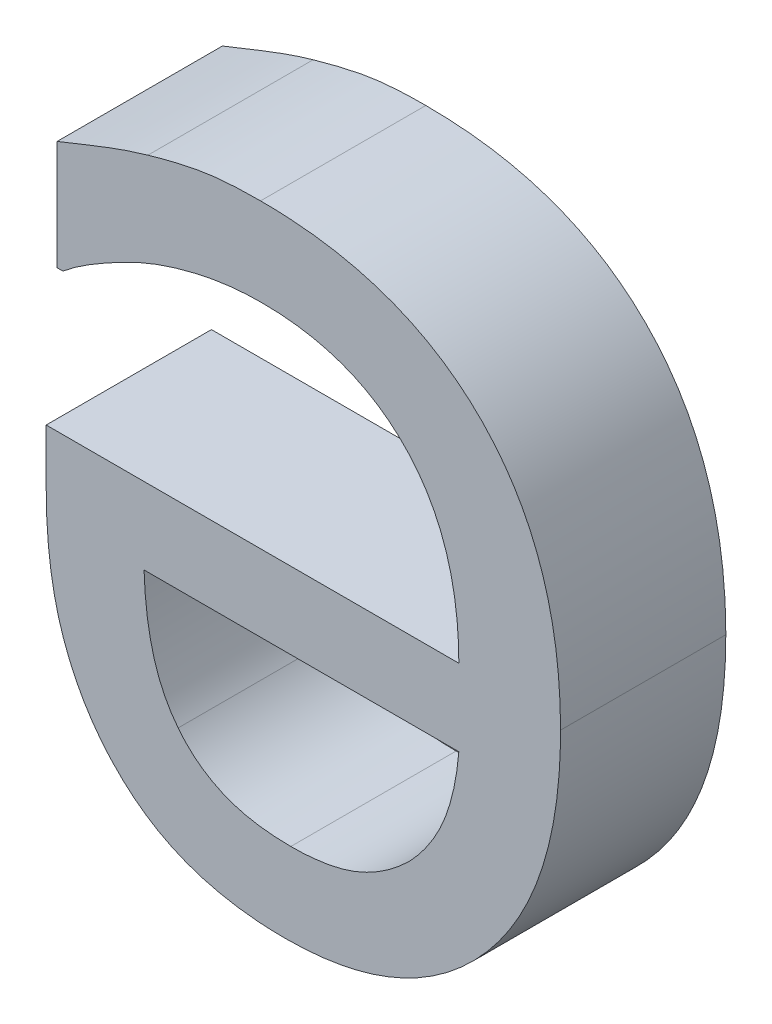
ISO-10303-21;
HEADER;
FILE_DESCRIPTION(('STEP AP214'),'2;1');
FILE_NAME('part.step','',(''),(''),'','','');
FILE_SCHEMA(('AUTOMOTIVE_DESIGN { 1 0 10303 214 1 1 1 1 }'));
ENDSEC;
DATA;
#1=APPLICATION_CONTEXT('core data for automotive mechanical design processes');
#2=APPLICATION_PROTOCOL_DEFINITION('international standard','automotive_design',2000,#1);
#3=PRODUCT_CONTEXT('',#1,'mechanical');
#4=PRODUCT('Part','Part','',(#3));
#5=PRODUCT_RELATED_PRODUCT_CATEGORY('part','',(#4));
#6=PRODUCT_DEFINITION_FORMATION('','',#4);
#7=PRODUCT_DEFINITION_CONTEXT('part definition',#1,'design');
#8=PRODUCT_DEFINITION('design','',#6,#7);
#9=PRODUCT_DEFINITION_SHAPE('','',#8);
#10=(LENGTH_UNIT() NAMED_UNIT(*) SI_UNIT(.MILLI.,.METRE.));
#11=(NAMED_UNIT(*) PLANE_ANGLE_UNIT() SI_UNIT($,.RADIAN.));
#12=(NAMED_UNIT(*) SI_UNIT($,.STERADIAN.) SOLID_ANGLE_UNIT());
#13=UNCERTAINTY_MEASURE_WITH_UNIT(LENGTH_MEASURE(1.E-05),#10,'distance_accuracy_value','');
#14=(GEOMETRIC_REPRESENTATION_CONTEXT(3) GLOBAL_UNCERTAINTY_ASSIGNED_CONTEXT((#13)) GLOBAL_UNIT_ASSIGNED_CONTEXT((#10,
#11,#12)) REPRESENTATION_CONTEXT('',''));
#15=CARTESIAN_POINT('',(0.,0.,0.));
#16=DIRECTION('',(0.,0.,1.));
#17=DIRECTION('',(1.,0.,0.));
#18=AXIS2_PLACEMENT_3D('',#15,#16,#17);
#19=CARTESIAN_POINT('',(-8.124000594715,-7.72739604329,0.));
#20=DIRECTION('',(0.,1.,0.));
#21=DIRECTION('',(-1.,0.,0.));
#22=AXIS2_PLACEMENT_3D('',#19,#20,#21);
#23=PLANE('',#22);
#24=DIRECTION('',(-1.,0.,0.));
#25=VECTOR('',#24,1.);
#26=CARTESIAN_POINT('',(-8.174873046972,-7.72739604329,0.));
#27=LINE('',#26,#25);
#28=CARTESIAN_POINT('',(-8.124000594715,-7.72739604329,0.));
#29=VERTEX_POINT('',#28);
#30=CARTESIAN_POINT('',(-8.314500279937,-7.72739604329,0.));
#31=VERTEX_POINT('',#30);
#32=EDGE_CURVE('E11',#29,#31,#27,.T.);
#33=ORIENTED_EDGE('',*,*,#32,.F.);
#34=DIRECTION('',(0.,0.,1.));
#35=VECTOR('',#34,1.);
#36=CARTESIAN_POINT('',(-8.124000594715,-7.72739604329,0.));
#37=LINE('',#36,#35);
#38=CARTESIAN_POINT('',(-8.124000594715,-7.72739604329,0.1));
#39=VERTEX_POINT('',#38);
#40=EDGE_CURVE('E24',#29,#39,#37,.T.);
#41=ORIENTED_EDGE('',*,*,#40,.T.);
#42=DIRECTION('',(1.,0.,0.));
#43=VECTOR('',#42,1.);
#44=CARTESIAN_POINT('',(-8.174873046972,-7.72739604329,0.1));
#45=LINE('',#44,#43);
#46=CARTESIAN_POINT('',(-8.314500279937,-7.72739604329,0.1));
#47=VERTEX_POINT('',#46);
#48=EDGE_CURVE('E414',#47,#39,#45,.T.);
#49=ORIENTED_EDGE('',*,*,#48,.F.);
#50=DIRECTION('',(0.,0.,1.));
#51=VECTOR('',#50,1.);
#52=CARTESIAN_POINT('',(-8.314500279937,-7.72739604329,0.));
#53=LINE('',#52,#51);
#54=EDGE_CURVE('E408',#31,#47,#53,.T.);
#55=ORIENTED_EDGE('',*,*,#54,.F.);
#56=EDGE_LOOP('',(#33,#41,#49,#55));
#57=FACE_BOUND('',#56,.T.);
#58=ADVANCED_FACE('F17',(#57),#23,.F.);
#59=CARTESIAN_POINT('',(-8.153607907756,-7.799466476349,0.));
#60=CARTESIAN_POINT('',(-8.153607907756,-7.799466476349,0.1));
#61=CARTESIAN_POINT('',(-8.139972960961,-7.785052389737,0.));
#62=CARTESIAN_POINT('',(-8.139972960961,-7.785052389737,0.1));
#63=CARTESIAN_POINT('',(-8.125948444258,-7.750380667887,0.));
#64=CARTESIAN_POINT('',(-8.125948444258,-7.750380667887,0.1));
#65=CARTESIAN_POINT('',(-8.124000594715,-7.72739604329,0.));
#66=CARTESIAN_POINT('',(-8.124000594715,-7.72739604329,0.1));
#67=B_SPLINE_SURFACE_WITH_KNOTS('',2,1,((#59,#60),(#61,#62),(#63,#64),(#65,#66)),.UNSPECIFIED.,
.F.,.F.,.F.,(3,1,3),(2,2),(0.,1.,2.),(0.,0.01),.UNSPECIFIED.);
#68=CARTESIAN_POINT('',(-8.153607907756,-7.799466476349,0.));
#69=CARTESIAN_POINT('',(-8.139972960961,-7.785052389737,0.));
#70=CARTESIAN_POINT('',(-8.125948444258,-7.750380667887,0.));
#71=CARTESIAN_POINT('',(-8.124000594715,-7.72739604329,0.));
#72=B_SPLINE_CURVE_WITH_KNOTS('',2,(#68,#69,#70,#71),.UNSPECIFIED.,.F.,.F.,(3,1,3),(0.,1.,2.),.UNSPECIFIED.);
#73=CARTESIAN_POINT('',(-8.153607907756,-7.799466476349,0.));
#74=VERTEX_POINT('',#73);
#75=EDGE_CURVE('E404',#74,#29,#72,.T.);
#76=DIRECTION('',(0.,0.,1.));
#77=VECTOR('',#76,1.);
#78=CARTESIAN_POINT('',(-8.153607907756,-7.799466476349,0.));
#79=LINE('',#78,#77);
#80=CARTESIAN_POINT('',(-8.153607907756,-7.799466476349,0.1));
#81=VERTEX_POINT('',#80);
#82=EDGE_CURVE('E398',#74,#81,#79,.T.);
#83=CARTESIAN_POINT('',(-8.124000594715,-7.72739604329,0.1));
#84=CARTESIAN_POINT('',(-8.125948444258,-7.750380667887,0.1));
#85=CARTESIAN_POINT('',(-8.139972960961,-7.785052389737,0.1));
#86=CARTESIAN_POINT('',(-8.153607907756,-7.799466476349,0.1));
#87=B_SPLINE_CURVE_WITH_KNOTS('',2,(#83,#84,#85,#86),.UNSPECIFIED.,.F.,.F.,(3,1,3),(-2.,-1.,0.),.UNSPECIFIED.);
#88=EDGE_CURVE('E391',#39,#81,#87,.T.);
#89=ORIENTED_EDGE('',*,*,#75,.F.);
#90=ORIENTED_EDGE('',*,*,#82,.T.);
#91=ORIENTED_EDGE('',*,*,#88,.F.);
#92=ORIENTED_EDGE('',*,*,#40,.F.);
#93=EDGE_LOOP('',(#89,#90,#91,#92));
#94=FACE_BOUND('',#93,.T.);
#95=ADVANCED_FACE('F420',(#94),#67,.F.);
#96=CARTESIAN_POINT('',(-8.225678340815,-7.827905079665,0.));
#97=CARTESIAN_POINT('',(-8.225678340815,-7.827905079665,0.1));
#98=CARTESIAN_POINT('',(-8.201525006493,-7.827905079665,0.));
#99=CARTESIAN_POINT('',(-8.201525006493,-7.827905079665,0.1));
#100=CARTESIAN_POINT('',(-8.167632424459,-7.813490993053,0.));
#101=CARTESIAN_POINT('',(-8.167632424459,-7.813490993053,0.1));
#102=CARTESIAN_POINT('',(-8.153607907756,-7.799466476349,0.));
#103=CARTESIAN_POINT('',(-8.153607907756,-7.799466476349,0.1));
#104=B_SPLINE_SURFACE_WITH_KNOTS('',2,1,((#96,#97),(#98,#99),(#100,#101),(#102,#103)),
.UNSPECIFIED.,.F.,.F.,.F.,(3,1,3),(2,2),(0.,1.,2.),(0.,0.01),.UNSPECIFIED.);
#105=CARTESIAN_POINT('',(-8.225678340815,-7.827905079665,0.));
#106=CARTESIAN_POINT('',(-8.201525006493,-7.827905079665,0.));
#107=CARTESIAN_POINT('',(-8.167632424459,-7.813490993053,0.));
#108=CARTESIAN_POINT('',(-8.153607907756,-7.799466476349,0.));
#109=B_SPLINE_CURVE_WITH_KNOTS('',2,(#105,#106,#107,#108),.UNSPECIFIED.,.F.,.F.,(3,1,3),(0.,1.,
2.),.UNSPECIFIED.);
#110=CARTESIAN_POINT('',(-8.225678340815,-7.827905079665,0.));
#111=VERTEX_POINT('',#110);
#112=EDGE_CURVE('E386',#111,#74,#109,.T.);
#113=DIRECTION('',(0.,0.,1.));
#114=VECTOR('',#113,1.);
#115=CARTESIAN_POINT('',(-8.225678340815,-7.827905079665,0.));
#116=LINE('',#115,#114);
#117=CARTESIAN_POINT('',(-8.225678340815,-7.827905079665,0.1));
#118=VERTEX_POINT('',#117);
#119=EDGE_CURVE('E380',#111,#118,#116,.T.);
#120=CARTESIAN_POINT('',(-8.153607907756,-7.799466476349,0.1));
#121=CARTESIAN_POINT('',(-8.167632424459,-7.813490993053,0.1));
#122=CARTESIAN_POINT('',(-8.201525006493,-7.827905079665,0.1));
#123=CARTESIAN_POINT('',(-8.225678340815,-7.827905079665,0.1));
#124=B_SPLINE_CURVE_WITH_KNOTS('',2,(#120,#121,#122,#123),.UNSPECIFIED.,.F.,.F.,(3,1,3),(-2.,
-1.,0.),.UNSPECIFIED.);
#125=EDGE_CURVE('E373',#81,#118,#124,.T.);
#126=ORIENTED_EDGE('',*,*,#112,.F.);
#127=ORIENTED_EDGE('',*,*,#119,.T.);
#128=ORIENTED_EDGE('',*,*,#125,.F.);
#129=ORIENTED_EDGE('',*,*,#82,.F.);
#130=EDGE_LOOP('',(#126,#127,#128,#129));
#131=FACE_BOUND('',#130,.T.);
#132=ADVANCED_FACE('F424',(#131),#104,.F.);
#133=CARTESIAN_POINT('',(-8.29385307479,-7.799856046258,0.));
#134=CARTESIAN_POINT('',(-8.29385307479,-7.799856046258,0.1));
#135=CARTESIAN_POINT('',(-8.283334687263,-7.813490993053,0.));
#136=CARTESIAN_POINT('',(-8.283334687263,-7.813490993053,0.1));
#137=CARTESIAN_POINT('',(-8.250221245046,-7.827905079665,0.));
#138=CARTESIAN_POINT('',(-8.250221245046,-7.827905079665,0.1));
#139=CARTESIAN_POINT('',(-8.225678340815,-7.827905079665,0.));
#140=CARTESIAN_POINT('',(-8.225678340815,-7.827905079665,0.1));
#141=B_SPLINE_SURFACE_WITH_KNOTS('',2,1,((#133,#134),(#135,#136),(#137,#138),(#139,#140)),
.UNSPECIFIED.,.F.,.F.,.F.,(3,1,3),(2,2),(0.,1.,2.),(0.,0.01),.UNSPECIFIED.);
#142=CARTESIAN_POINT('',(-8.29385307479,-7.799856046258,0.));
#143=CARTESIAN_POINT('',(-8.283334687263,-7.813490993053,0.));
#144=CARTESIAN_POINT('',(-8.250221245046,-7.827905079665,0.));
#145=CARTESIAN_POINT('',(-8.225678340815,-7.827905079665,0.));
#146=B_SPLINE_CURVE_WITH_KNOTS('',2,(#142,#143,#144,#145),.UNSPECIFIED.,.F.,.F.,(3,1,3),(0.,1.,
2.),.UNSPECIFIED.);
#147=CARTESIAN_POINT('',(-8.29385307479,-7.799856046258,0.));
#148=VERTEX_POINT('',#147);
#149=EDGE_CURVE('E368',#148,#111,#146,.T.);
#150=DIRECTION('',(0.,0.,1.));
#151=VECTOR('',#150,1.);
#152=CARTESIAN_POINT('',(-8.29385307479,-7.799856046258,0.));
#153=LINE('',#152,#151);
#154=CARTESIAN_POINT('',(-8.29385307479,-7.799856046258,0.1));
#155=VERTEX_POINT('',#154);
#156=EDGE_CURVE('E362',#148,#155,#153,.T.);
#157=CARTESIAN_POINT('',(-8.225678340815,-7.827905079665,0.1));
#158=CARTESIAN_POINT('',(-8.250221245046,-7.827905079665,0.1));
#159=CARTESIAN_POINT('',(-8.283334687263,-7.813490993053,0.1));
#160=CARTESIAN_POINT('',(-8.29385307479,-7.799856046258,0.1));
#161=B_SPLINE_CURVE_WITH_KNOTS('',2,(#157,#158,#159,#160),.UNSPECIFIED.,.F.,.F.,(3,1,3),(-2.,
-1.,0.),.UNSPECIFIED.);
#162=EDGE_CURVE('E355',#118,#155,#161,.T.);
#163=ORIENTED_EDGE('',*,*,#149,.F.);
#164=ORIENTED_EDGE('',*,*,#156,.T.);
#165=ORIENTED_EDGE('',*,*,#162,.F.);
#166=ORIENTED_EDGE('',*,*,#119,.F.);
#167=EDGE_LOOP('',(#163,#164,#165,#166));
#168=FACE_BOUND('',#167,.T.);
#169=ADVANCED_FACE('F428',(#168),#141,.F.);
#170=CARTESIAN_POINT('',(-8.314500279937,-7.72739604329,0.));
#171=CARTESIAN_POINT('',(-8.314500279937,-7.72739604329,0.1));
#172=CARTESIAN_POINT('',(-8.31372114012,-7.751938947521,0.));
#173=CARTESIAN_POINT('',(-8.31372114012,-7.751938947521,0.1));
#174=CARTESIAN_POINT('',(-8.303592322501,-7.787779379096,0.));
#175=CARTESIAN_POINT('',(-8.303592322501,-7.787779379096,0.1));
#176=CARTESIAN_POINT('',(-8.29385307479,-7.799856046258,0.));
#177=CARTESIAN_POINT('',(-8.29385307479,-7.799856046258,0.1));
#178=B_SPLINE_SURFACE_WITH_KNOTS('',2,1,((#170,#171),(#172,#173),(#174,#175),(#176,#177)),
.UNSPECIFIED.,.F.,.F.,.F.,(3,1,3),(2,2),(0.,1.,2.),(0.,0.01),.UNSPECIFIED.);
#179=CARTESIAN_POINT('',(-8.314500279937,-7.72739604329,0.));
#180=CARTESIAN_POINT('',(-8.31372114012,-7.751938947521,0.));
#181=CARTESIAN_POINT('',(-8.303592322501,-7.787779379096,0.));
#182=CARTESIAN_POINT('',(-8.29385307479,-7.799856046258,0.));
#183=B_SPLINE_CURVE_WITH_KNOTS('',2,(#179,#180,#181,#182),.UNSPECIFIED.,.F.,.F.,(3,1,3),(0.,1.,
2.),.UNSPECIFIED.);
#184=EDGE_CURVE('E348',#31,#148,#183,.T.);
#185=CARTESIAN_POINT('',(-8.29385307479,-7.799856046258,0.1));
#186=CARTESIAN_POINT('',(-8.303592322501,-7.787779379096,0.1));
#187=CARTESIAN_POINT('',(-8.31372114012,-7.751938947521,0.1));
#188=CARTESIAN_POINT('',(-8.314500279937,-7.72739604329,0.1));
#189=B_SPLINE_CURVE_WITH_KNOTS('',2,(#185,#186,#187,#188),.UNSPECIFIED.,.F.,.F.,(3,1,3),(-2.,
-1.,0.),.UNSPECIFIED.);
#190=EDGE_CURVE('E340',#155,#47,#189,.T.);
#191=ORIENTED_EDGE('',*,*,#184,.F.);
#192=ORIENTED_EDGE('',*,*,#54,.T.);
#193=ORIENTED_EDGE('',*,*,#190,.F.);
#194=ORIENTED_EDGE('',*,*,#156,.F.);
#195=EDGE_LOOP('',(#191,#192,#193,#194));
#196=FACE_BOUND('',#195,.T.);
#197=ADVANCED_FACE('F431',(#196),#178,.F.);
#198=CARTESIAN_POINT('',(-8.229184469991,-7.877770027944,0.));
#199=CARTESIAN_POINT('',(-8.229184469991,-7.877770027944,0.1));
#200=CARTESIAN_POINT('',(-8.154776617481,-7.877770027944,0.));
#201=CARTESIAN_POINT('',(-8.154776617481,-7.877770027944,0.1));
#202=CARTESIAN_POINT('',(-8.062448549184,-7.773365292485,0.));
#203=CARTESIAN_POINT('',(-8.062448549184,-7.773365292485,0.1));
#204=CARTESIAN_POINT('',(-8.062448549184,-7.68532249318,0.));
#205=CARTESIAN_POINT('',(-8.062448549184,-7.68532249318,0.1));
#206=B_SPLINE_SURFACE_WITH_KNOTS('',2,1,((#198,#199),(#200,#201),(#202,#203),(#204,#205)),
.UNSPECIFIED.,.F.,.F.,.F.,(3,1,3),(2,2),(-2.,-1.,0.),(0.,0.01),.UNSPECIFIED.);
#207=CARTESIAN_POINT('',(-8.062448549184,-7.68532249318,0.));
#208=CARTESIAN_POINT('',(-8.062448549184,-7.773365292485,0.));
#209=CARTESIAN_POINT('',(-8.154776617481,-7.877770027944,0.));
#210=CARTESIAN_POINT('',(-8.229184469991,-7.877770027944,0.));
#211=B_SPLINE_CURVE_WITH_KNOTS('',2,(#207,#208,#209,#210),.UNSPECIFIED.,.F.,.F.,(3,1,3),(0.,1.,
2.),.UNSPECIFIED.);
#212=CARTESIAN_POINT('',(-8.062448549184,-7.68532249318,0.));
#213=VERTEX_POINT('',#212);
#214=CARTESIAN_POINT('',(-8.229184469991,-7.877770027944,0.));
#215=VERTEX_POINT('',#214);
#216=EDGE_CURVE('E336',#213,#215,#211,.T.);
#217=DIRECTION('',(0.,0.,1.));
#218=VECTOR('',#217,1.);
#219=CARTESIAN_POINT('',(-8.062448549184,-7.68532249318,0.));
#220=LINE('',#219,#218);
#221=CARTESIAN_POINT('',(-8.062448549184,-7.68532249318,0.1));
#222=VERTEX_POINT('',#221);
#223=EDGE_CURVE('E331',#213,#222,#220,.T.);
#224=CARTESIAN_POINT('',(-8.229184469991,-7.877770027944,0.1));
#225=CARTESIAN_POINT('',(-8.154776617481,-7.877770027944,0.1));
#226=CARTESIAN_POINT('',(-8.062448549184,-7.773365292485,0.1));
#227=CARTESIAN_POINT('',(-8.062448549184,-7.68532249318,0.1));
#228=B_SPLINE_CURVE_WITH_KNOTS('',2,(#224,#225,#226,#227),.UNSPECIFIED.,.F.,.F.,(3,1,3),(-2.,
-1.,0.),.UNSPECIFIED.);
#229=CARTESIAN_POINT('',(-8.229184469991,-7.877770027944,0.1));
#230=VERTEX_POINT('',#229);
#231=EDGE_CURVE('E164',#230,#222,#228,.T.);
#232=DIRECTION('',(0.,0.,1.));
#233=VECTOR('',#232,1.);
#234=CARTESIAN_POINT('',(-8.229184469991,-7.877770027944,0.));
#235=LINE('',#234,#233);
#236=EDGE_CURVE('E322',#215,#230,#235,.T.);
#237=ORIENTED_EDGE('',*,*,#216,.F.);
#238=ORIENTED_EDGE('',*,*,#223,.T.);
#239=ORIENTED_EDGE('',*,*,#231,.F.);
#240=ORIENTED_EDGE('',*,*,#236,.F.);
#241=EDGE_LOOP('',(#237,#238,#239,#240));
#242=FACE_BOUND('',#241,.T.);
#243=ADVANCED_FACE('F479',(#242),#206,.T.);
#244=CARTESIAN_POINT('',(-8.33358920545,-7.837644327375,0.));
#245=CARTESIAN_POINT('',(-8.33358920545,-7.837644327375,0.1));
#246=CARTESIAN_POINT('',(-8.314500279937,-7.858291532522,0.));
#247=CARTESIAN_POINT('',(-8.314500279937,-7.858291532522,0.1));
#248=CARTESIAN_POINT('',(-8.262687482116,-7.877770027944,0.));
#249=CARTESIAN_POINT('',(-8.262687482116,-7.877770027944,0.1));
#250=CARTESIAN_POINT('',(-8.229184469991,-7.877770027944,0.));
#251=CARTESIAN_POINT('',(-8.229184469991,-7.877770027944,0.1));
#252=B_SPLINE_SURFACE_WITH_KNOTS('',2,1,((#244,#245),(#246,#247),(#248,#249),(#250,#251)),
.UNSPECIFIED.,.F.,.F.,.F.,(3,1,3),(2,2),(-2.,-1.,0.),(0.,0.01),.UNSPECIFIED.);
#253=CARTESIAN_POINT('',(-8.229184469991,-7.877770027944,0.));
#254=CARTESIAN_POINT('',(-8.262687482116,-7.877770027944,0.));
#255=CARTESIAN_POINT('',(-8.314500279937,-7.858291532522,0.));
#256=CARTESIAN_POINT('',(-8.33358920545,-7.837644327375,0.));
#257=B_SPLINE_CURVE_WITH_KNOTS('',2,(#253,#254,#255,#256),.UNSPECIFIED.,.F.,.F.,(3,1,3),(0.,1.,
2.),.UNSPECIFIED.);
#258=CARTESIAN_POINT('',(-8.33358920545,-7.837644327375,0.));
#259=VERTEX_POINT('',#258);
#260=EDGE_CURVE('E315',#215,#259,#257,.T.);
#261=CARTESIAN_POINT('',(-8.33358920545,-7.837644327375,0.1));
#262=CARTESIAN_POINT('',(-8.314500279937,-7.858291532522,0.1));
#263=CARTESIAN_POINT('',(-8.262687482116,-7.877770027944,0.1));
#264=CARTESIAN_POINT('',(-8.229184469991,-7.877770027944,0.1));
#265=B_SPLINE_CURVE_WITH_KNOTS('',2,(#261,#262,#263,#264),.UNSPECIFIED.,.F.,.F.,(3,1,3),(-2.,
-1.,0.),.UNSPECIFIED.);
#266=CARTESIAN_POINT('',(-8.33358920545,-7.837644327375,0.1));
#267=VERTEX_POINT('',#266);
#268=EDGE_CURVE('E311',#267,#230,#265,.T.);
#269=DIRECTION('',(0.,0.,1.));
#270=VECTOR('',#269,1.);
#271=CARTESIAN_POINT('',(-8.33358920545,-7.837644327375,0.));
#272=LINE('',#271,#270);
#273=EDGE_CURVE('E305',#259,#267,#272,.T.);
#274=ORIENTED_EDGE('',*,*,#260,.F.);
#275=ORIENTED_EDGE('',*,*,#236,.T.);
#276=ORIENTED_EDGE('',*,*,#268,.F.);
#277=ORIENTED_EDGE('',*,*,#273,.F.);
#278=EDGE_LOOP('',(#274,#275,#276,#277));
#279=FACE_BOUND('',#278,.T.);
#280=ADVANCED_FACE('F489',(#279),#252,.T.);
#281=CARTESIAN_POINT('',(-8.373714906018,-7.714150666403,0.));
#282=CARTESIAN_POINT('',(-8.373714906018,-7.714150666403,0.1));
#283=CARTESIAN_POINT('',(-8.373714906018,-7.757392926239,0.));
#284=CARTESIAN_POINT('',(-8.373714906018,-7.757392926239,0.1));
#285=CARTESIAN_POINT('',(-8.353067700872,-7.816997122229,0.));
#286=CARTESIAN_POINT('',(-8.353067700872,-7.816997122229,0.1));
#287=CARTESIAN_POINT('',(-8.33358920545,-7.837644327375,0.));
#288=CARTESIAN_POINT('',(-8.33358920545,-7.837644327375,0.1));
#289=B_SPLINE_SURFACE_WITH_KNOTS('',2,1,((#281,#282),(#283,#284),(#285,#286),(#287,#288)),
.UNSPECIFIED.,.F.,.F.,.F.,(3,1,3),(2,2),(-2.,-1.,0.),(0.,0.01),.UNSPECIFIED.);
#290=CARTESIAN_POINT('',(-8.33358920545,-7.837644327375,0.));
#291=CARTESIAN_POINT('',(-8.353067700872,-7.816997122229,0.));
#292=CARTESIAN_POINT('',(-8.373714906018,-7.757392926239,0.));
#293=CARTESIAN_POINT('',(-8.373714906018,-7.714150666403,0.));
#294=B_SPLINE_CURVE_WITH_KNOTS('',2,(#290,#291,#292,#293),.UNSPECIFIED.,.F.,.F.,(3,1,3),(0.,1.,
2.),.UNSPECIFIED.);
#295=CARTESIAN_POINT('',(-8.373714906018,-7.714150666403,0.));
#296=VERTEX_POINT('',#295);
#297=EDGE_CURVE('E298',#259,#296,#294,.T.);
#298=CARTESIAN_POINT('',(-8.373714906018,-7.714150666403,0.1));
#299=CARTESIAN_POINT('',(-8.373714906018,-7.757392926239,0.1));
#300=CARTESIAN_POINT('',(-8.353067700872,-7.816997122229,0.1));
#301=CARTESIAN_POINT('',(-8.33358920545,-7.837644327375,0.1));
#302=B_SPLINE_CURVE_WITH_KNOTS('',2,(#298,#299,#300,#301),.UNSPECIFIED.,.F.,.F.,(3,1,3),(-2.,
-1.,0.),.UNSPECIFIED.);
#303=CARTESIAN_POINT('',(-8.373714906018,-7.714150666403,0.1));
#304=VERTEX_POINT('',#303);
#305=EDGE_CURVE('E293',#304,#267,#302,.T.);
#306=DIRECTION('',(0.,0.,1.));
#307=VECTOR('',#306,1.);
#308=CARTESIAN_POINT('',(-8.373714906018,-7.714150666403,0.));
#309=LINE('',#308,#307);
#310=EDGE_CURVE('E290',#296,#304,#309,.T.);
#311=ORIENTED_EDGE('',*,*,#297,.F.);
#312=ORIENTED_EDGE('',*,*,#273,.T.);
#313=ORIENTED_EDGE('',*,*,#305,.F.);
#314=ORIENTED_EDGE('',*,*,#310,.F.);
#315=EDGE_LOOP('',(#311,#312,#313,#314));
#316=FACE_BOUND('',#315,.T.);
#317=ADVANCED_FACE('F500',(#316),#289,.T.);
#318=CARTESIAN_POINT('',(-8.373714906018,-7.681037224187,0.));
#319=DIRECTION('',(-1.,0.,0.));
#320=DIRECTION('',(0.,-1.,0.));
#321=AXIS2_PLACEMENT_3D('',#318,#319,#320);
#322=PLANE('',#321);
#323=DIRECTION('',(0.,1.,0.));
#324=VECTOR('',#323,1.);
#325=CARTESIAN_POINT('',(-8.373714906018,-7.714150666403,0.));
#326=LINE('',#325,#324);
#327=CARTESIAN_POINT('',(-8.373714906018,-7.681037224187,0.));
#328=VERTEX_POINT('',#327);
#329=EDGE_CURVE('E288',#296,#328,#326,.T.);
#330=ORIENTED_EDGE('',*,*,#329,.F.);
#331=ORIENTED_EDGE('',*,*,#310,.T.);
#332=DIRECTION('',(0.,-1.,0.));
#333=VECTOR('',#332,1.);
#334=CARTESIAN_POINT('',(-8.373714906018,-7.714150666403,0.1));
#335=LINE('',#334,#333);
#336=CARTESIAN_POINT('',(-8.373714906018,-7.681037224187,0.1));
#337=VERTEX_POINT('',#336);
#338=EDGE_CURVE('E285',#337,#304,#335,.T.);
#339=ORIENTED_EDGE('',*,*,#338,.F.);
#340=DIRECTION('',(0.,0.,1.));
#341=VECTOR('',#340,1.);
#342=CARTESIAN_POINT('',(-8.373714906018,-7.681037224187,0.));
#343=LINE('',#342,#341);
#344=EDGE_CURVE('E282',#328,#337,#343,.T.);
#345=ORIENTED_EDGE('',*,*,#344,.F.);
#346=EDGE_LOOP('',(#330,#331,#339,#345));
#347=FACE_BOUND('',#346,.T.);
#348=ADVANCED_FACE('F511',(#347),#322,.T.);
#349=CARTESIAN_POINT('',(-8.124000594715,-7.681037224187,0.));
#350=DIRECTION('',(0.,1.,0.));
#351=DIRECTION('',(-1.,0.,0.));
#352=AXIS2_PLACEMENT_3D('',#349,#350,#351);
#353=PLANE('',#352);
#354=DIRECTION('',(1.,0.,0.));
#355=VECTOR('',#354,1.);
#356=CARTESIAN_POINT('',(-8.373714906018,-7.681037224187,0.));
#357=LINE('',#356,#355);
#358=CARTESIAN_POINT('',(-8.124000594715,-7.681037224187,0.));
#359=VERTEX_POINT('',#358);
#360=EDGE_CURVE('E280',#328,#359,#357,.T.);
#361=ORIENTED_EDGE('',*,*,#360,.F.);
#362=ORIENTED_EDGE('',*,*,#344,.T.);
#363=DIRECTION('',(-1.,0.,0.));
#364=VECTOR('',#363,1.);
#365=CARTESIAN_POINT('',(-8.373714906018,-7.681037224187,0.1));
#366=LINE('',#365,#364);
#367=CARTESIAN_POINT('',(-8.124000594715,-7.681037224187,0.1));
#368=VERTEX_POINT('',#367);
#369=EDGE_CURVE('E277',#368,#337,#366,.T.);
#370=ORIENTED_EDGE('',*,*,#369,.F.);
#371=DIRECTION('',(0.,0.,1.));
#372=VECTOR('',#371,1.);
#373=CARTESIAN_POINT('',(-8.124000594715,-7.681037224187,0.));
#374=LINE('',#373,#372);
#375=EDGE_CURVE('E271',#359,#368,#374,.T.);
#376=ORIENTED_EDGE('',*,*,#375,.F.);
#377=EDGE_LOOP('',(#361,#362,#370,#376));
#378=FACE_BOUND('',#377,.T.);
#379=ADVANCED_FACE('F520',(#378),#353,.T.);
#380=CARTESIAN_POINT('',(-8.243208986695,-7.551700014589,0.));
#381=CARTESIAN_POINT('',(-8.243208986695,-7.551700014589,0.1));
#382=CARTESIAN_POINT('',(-8.187110919881,-7.551700014589,0.));
#383=CARTESIAN_POINT('',(-8.187110919881,-7.551700014589,0.1));
#384=CARTESIAN_POINT('',(-8.124000594715,-7.61831646893,0.));
#385=CARTESIAN_POINT('',(-8.124000594715,-7.61831646893,0.1));
#386=CARTESIAN_POINT('',(-8.124000594715,-7.681037224187,0.));
#387=CARTESIAN_POINT('',(-8.124000594715,-7.681037224187,0.1));
#388=B_SPLINE_SURFACE_WITH_KNOTS('',2,1,((#380,#381),(#382,#383),(#384,#385),(#386,#387)),
.UNSPECIFIED.,.F.,.F.,.F.,(3,1,3),(2,2),(-2.,-1.,0.),(0.,0.01),.UNSPECIFIED.);
#389=CARTESIAN_POINT('',(-8.124000594715,-7.681037224187,0.));
#390=CARTESIAN_POINT('',(-8.124000594715,-7.61831646893,0.));
#391=CARTESIAN_POINT('',(-8.187110919881,-7.551700014589,0.));
#392=CARTESIAN_POINT('',(-8.243208986695,-7.551700014589,0.));
#393=B_SPLINE_CURVE_WITH_KNOTS('',2,(#389,#390,#391,#392),.UNSPECIFIED.,.F.,.F.,(3,1,3),(0.,1.,
2.),.UNSPECIFIED.);
#394=CARTESIAN_POINT('',(-8.243208986695,-7.551700014589,0.));
#395=VERTEX_POINT('',#394);
#396=EDGE_CURVE('E264',#359,#395,#393,.T.);
#397=CARTESIAN_POINT('',(-8.243208986695,-7.551700014589,0.1));
#398=CARTESIAN_POINT('',(-8.187110919881,-7.551700014589,0.1));
#399=CARTESIAN_POINT('',(-8.124000594715,-7.61831646893,0.1));
#400=CARTESIAN_POINT('',(-8.124000594715,-7.681037224187,0.1));
#401=B_SPLINE_CURVE_WITH_KNOTS('',2,(#397,#398,#399,#400),.UNSPECIFIED.,.F.,.F.,(3,1,3),(-2.,
-1.,0.),.UNSPECIFIED.);
#402=CARTESIAN_POINT('',(-8.243208986695,-7.551700014589,0.1));
#403=VERTEX_POINT('',#402);
#404=EDGE_CURVE('E259',#403,#368,#401,.T.);
#405=DIRECTION('',(0.,0.,1.));
#406=VECTOR('',#405,1.);
#407=CARTESIAN_POINT('',(-8.243208986695,-7.551700014589,0.));
#408=LINE('',#407,#406);
#409=EDGE_CURVE('E253',#395,#403,#408,.T.);
#410=ORIENTED_EDGE('',*,*,#396,.F.);
#411=ORIENTED_EDGE('',*,*,#375,.T.);
#412=ORIENTED_EDGE('',*,*,#404,.F.);
#413=ORIENTED_EDGE('',*,*,#409,.F.);
#414=EDGE_LOOP('',(#410,#411,#412,#413));
#415=FACE_BOUND('',#414,.T.);
#416=ADVANCED_FACE('F524',(#415),#388,.T.);
#417=CARTESIAN_POINT('',(-8.317227269296,-7.567672380834,0.));
#418=CARTESIAN_POINT('',(-8.317227269296,-7.567672380834,0.1));
#419=CARTESIAN_POINT('',(-8.301644472959,-7.560660122482,0.));
#420=CARTESIAN_POINT('',(-8.301644472959,-7.560660122482,0.1));
#421=CARTESIAN_POINT('',(-8.263077052024,-7.551700014589,0.));
#422=CARTESIAN_POINT('',(-8.263077052024,-7.551700014589,0.1));
#423=CARTESIAN_POINT('',(-8.243208986695,-7.551700014589,0.));
#424=CARTESIAN_POINT('',(-8.243208986695,-7.551700014589,0.1));
#425=B_SPLINE_SURFACE_WITH_KNOTS('',2,1,((#417,#418),(#419,#420),(#421,#422),(#423,#424)),
.UNSPECIFIED.,.F.,.F.,.F.,(3,1,3),(2,2),(-2.,-1.,0.),(0.,0.01),.UNSPECIFIED.);
#426=CARTESIAN_POINT('',(-8.243208986695,-7.551700014589,0.));
#427=CARTESIAN_POINT('',(-8.263077052024,-7.551700014589,0.));
#428=CARTESIAN_POINT('',(-8.301644472959,-7.560660122482,0.));
#429=CARTESIAN_POINT('',(-8.317227269296,-7.567672380834,0.));
#430=B_SPLINE_CURVE_WITH_KNOTS('',2,(#426,#427,#428,#429),.UNSPECIFIED.,.F.,.F.,(3,1,3),(0.,1.,
2.),.UNSPECIFIED.);
#431=CARTESIAN_POINT('',(-8.317227269296,-7.567672380834,0.));
#432=VERTEX_POINT('',#431);
#433=EDGE_CURVE('E246',#395,#432,#430,.T.);
#434=CARTESIAN_POINT('',(-8.317227269296,-7.567672380834,0.1));
#435=CARTESIAN_POINT('',(-8.301644472959,-7.560660122482,0.1));
#436=CARTESIAN_POINT('',(-8.263077052024,-7.551700014589,0.1));
#437=CARTESIAN_POINT('',(-8.243208986695,-7.551700014589,0.1));
#438=B_SPLINE_CURVE_WITH_KNOTS('',2,(#434,#435,#436,#437),.UNSPECIFIED.,.F.,.F.,(3,1,3),(-2.,
-1.,0.),.UNSPECIFIED.);
#439=CARTESIAN_POINT('',(-8.317227269296,-7.567672380834,0.1));
#440=VERTEX_POINT('',#439);
#441=EDGE_CURVE('E241',#440,#403,#438,.T.);
#442=DIRECTION('',(0.,0.,1.));
#443=VECTOR('',#442,1.);
#444=CARTESIAN_POINT('',(-8.317227269296,-7.567672380834,0.));
#445=LINE('',#444,#443);
#446=EDGE_CURVE('E235',#432,#440,#445,.T.);
#447=ORIENTED_EDGE('',*,*,#433,.F.);
#448=ORIENTED_EDGE('',*,*,#409,.T.);
#449=ORIENTED_EDGE('',*,*,#441,.F.);
#450=ORIENTED_EDGE('',*,*,#446,.F.);
#451=EDGE_LOOP('',(#447,#448,#449,#450));
#452=FACE_BOUND('',#451,.T.);
#453=ADVANCED_FACE('F530',(#452),#425,.T.);
#454=CARTESIAN_POINT('',(-8.363586088399,-7.595331844333,0.));
#455=CARTESIAN_POINT('',(-8.363586088399,-7.595331844333,0.1));
#456=CARTESIAN_POINT('',(-8.356184260139,-7.589098725798,0.));
#457=CARTESIAN_POINT('',(-8.356184260139,-7.589098725798,0.1));
#458=CARTESIAN_POINT('',(-8.33358920545,-7.575463779003,0.));
#459=CARTESIAN_POINT('',(-8.33358920545,-7.575463779003,0.1));
#460=CARTESIAN_POINT('',(-8.317227269296,-7.567672380834,0.));
#461=CARTESIAN_POINT('',(-8.317227269296,-7.567672380834,0.1));
#462=B_SPLINE_SURFACE_WITH_KNOTS('',2,1,((#454,#455),(#456,#457),(#458,#459),(#460,#461)),
.UNSPECIFIED.,.F.,.F.,.F.,(3,1,3),(2,2),(-2.,-1.,0.),(0.,0.01),.UNSPECIFIED.);
#463=CARTESIAN_POINT('',(-8.317227269296,-7.567672380834,0.));
#464=CARTESIAN_POINT('',(-8.33358920545,-7.575463779003,0.));
#465=CARTESIAN_POINT('',(-8.356184260139,-7.589098725798,0.));
#466=CARTESIAN_POINT('',(-8.363586088399,-7.595331844333,0.));
#467=B_SPLINE_CURVE_WITH_KNOTS('',2,(#463,#464,#465,#466),.UNSPECIFIED.,.F.,.F.,(3,1,3),(0.,1.,
2.),.UNSPECIFIED.);
#468=CARTESIAN_POINT('',(-8.363586088399,-7.595331844333,0.));
#469=VERTEX_POINT('',#468);
#470=EDGE_CURVE('E228',#432,#469,#467,.T.);
#471=CARTESIAN_POINT('',(-8.363586088399,-7.595331844333,0.1));
#472=CARTESIAN_POINT('',(-8.356184260139,-7.589098725798,0.1));
#473=CARTESIAN_POINT('',(-8.33358920545,-7.575463779003,0.1));
#474=CARTESIAN_POINT('',(-8.317227269296,-7.567672380834,0.1));
#475=B_SPLINE_CURVE_WITH_KNOTS('',2,(#471,#472,#473,#474),.UNSPECIFIED.,.F.,.F.,(3,1,3),(-2.,
-1.,0.),.UNSPECIFIED.);
#476=CARTESIAN_POINT('',(-8.363586088399,-7.595331844333,0.1));
#477=VERTEX_POINT('',#476);
#478=EDGE_CURVE('E223',#477,#440,#475,.T.);
#479=DIRECTION('',(0.,0.,1.));
#480=VECTOR('',#479,1.);
#481=CARTESIAN_POINT('',(-8.363586088399,-7.595331844333,0.));
#482=LINE('',#481,#480);
#483=EDGE_CURVE('E220',#469,#477,#482,.T.);
#484=ORIENTED_EDGE('',*,*,#470,.F.);
#485=ORIENTED_EDGE('',*,*,#446,.T.);
#486=ORIENTED_EDGE('',*,*,#478,.F.);
#487=ORIENTED_EDGE('',*,*,#483,.F.);
#488=EDGE_LOOP('',(#484,#485,#486,#487));
#489=FACE_BOUND('',#488,.T.);
#490=ADVANCED_FACE('F541',(#489),#462,.T.);
#491=CARTESIAN_POINT('',(-8.367092217575,-7.595331844333,0.));
#492=DIRECTION('',(0.,-1.,0.));
#493=DIRECTION('',(1.,0.,0.));
#494=AXIS2_PLACEMENT_3D('',#491,#492,#493);
#495=PLANE('',#494);
#496=DIRECTION('',(-1.,0.,0.));
#497=VECTOR('',#496,1.);
#498=CARTESIAN_POINT('',(-8.363586088399,-7.595331844333,0.));
#499=LINE('',#498,#497);
#500=CARTESIAN_POINT('',(-8.367092217575,-7.595331844333,0.));
#501=VERTEX_POINT('',#500);
#502=EDGE_CURVE('E218',#469,#501,#499,.T.);
#503=ORIENTED_EDGE('',*,*,#502,.F.);
#504=ORIENTED_EDGE('',*,*,#483,.T.);
#505=DIRECTION('',(1.,0.,0.));
#506=VECTOR('',#505,1.);
#507=CARTESIAN_POINT('',(-8.363586088399,-7.595331844333,0.1));
#508=LINE('',#507,#506);
#509=CARTESIAN_POINT('',(-8.367092217575,-7.595331844333,0.1));
#510=VERTEX_POINT('',#509);
#511=EDGE_CURVE('E215',#510,#477,#508,.T.);
#512=ORIENTED_EDGE('',*,*,#511,.F.);
#513=DIRECTION('',(0.,0.,1.));
#514=VECTOR('',#513,1.);
#515=CARTESIAN_POINT('',(-8.367092217575,-7.595331844333,0.));
#516=LINE('',#515,#514);
#517=EDGE_CURVE('E212',#501,#510,#516,.T.);
#518=ORIENTED_EDGE('',*,*,#517,.F.);
#519=EDGE_LOOP('',(#503,#504,#512,#518));
#520=FACE_BOUND('',#519,.T.);
#521=ADVANCED_FACE('F552',(#520),#495,.T.);
#522=CARTESIAN_POINT('',(-8.367092217575,-7.5291049599,0.));
#523=DIRECTION('',(-1.,0.,0.));
#524=DIRECTION('',(0.,-1.,0.));
#525=AXIS2_PLACEMENT_3D('',#522,#523,#524);
#526=PLANE('',#525);
#527=DIRECTION('',(0.,1.,0.));
#528=VECTOR('',#527,1.);
#529=CARTESIAN_POINT('',(-8.367092217575,-7.595331844333,0.));
#530=LINE('',#529,#528);
#531=CARTESIAN_POINT('',(-8.367092217575,-7.5291049599,0.));
#532=VERTEX_POINT('',#531);
#533=EDGE_CURVE('E210',#501,#532,#530,.T.);
#534=ORIENTED_EDGE('',*,*,#533,.F.);
#535=ORIENTED_EDGE('',*,*,#517,.T.);
#536=DIRECTION('',(0.,-1.,0.));
#537=VECTOR('',#536,1.);
#538=CARTESIAN_POINT('',(-8.367092217575,-7.595331844333,0.1));
#539=LINE('',#538,#537);
#540=CARTESIAN_POINT('',(-8.367092217575,-7.5291049599,0.1));
#541=VERTEX_POINT('',#540);
#542=EDGE_CURVE('E207',#541,#510,#539,.T.);
#543=ORIENTED_EDGE('',*,*,#542,.F.);
#544=DIRECTION('',(0.,0.,1.));
#545=VECTOR('',#544,1.);
#546=CARTESIAN_POINT('',(-8.367092217575,-7.5291049599,0.));
#547=LINE('',#546,#545);
#548=EDGE_CURVE('E201',#532,#541,#547,.T.);
#549=ORIENTED_EDGE('',*,*,#548,.F.);
#550=EDGE_LOOP('',(#534,#535,#543,#549));
#551=FACE_BOUND('',#550,.T.);
#552=ADVANCED_FACE('F561',(#551),#526,.T.);
#553=CARTESIAN_POINT('',(-8.312162860487,-7.508847324661,0.));
#554=CARTESIAN_POINT('',(-8.312162860487,-7.508847324661,0.1));
#555=CARTESIAN_POINT('',(-8.324629097556,-7.512353453837,0.));
#556=CARTESIAN_POINT('',(-8.324629097556,-7.512353453837,0.1));
#557=CARTESIAN_POINT('',(-8.356573830047,-7.524819690907,0.));
#558=CARTESIAN_POINT('',(-8.356573830047,-7.524819690907,0.1));
#559=CARTESIAN_POINT('',(-8.367092217575,-7.5291049599,0.));
#560=CARTESIAN_POINT('',(-8.367092217575,-7.5291049599,0.1));
#561=B_SPLINE_SURFACE_WITH_KNOTS('',2,1,((#553,#554),(#555,#556),(#557,#558),(#559,#560)),
.UNSPECIFIED.,.F.,.F.,.F.,(3,1,3),(2,2),(-2.,-1.,0.),(0.,0.01),.UNSPECIFIED.);
#562=CARTESIAN_POINT('',(-8.367092217575,-7.5291049599,0.));
#563=CARTESIAN_POINT('',(-8.356573830047,-7.524819690907,0.));
#564=CARTESIAN_POINT('',(-8.324629097556,-7.512353453837,0.));
#565=CARTESIAN_POINT('',(-8.312162860487,-7.508847324661,0.));
#566=B_SPLINE_CURVE_WITH_KNOTS('',2,(#562,#563,#564,#565),.UNSPECIFIED.,.F.,.F.,(3,1,3),(0.,1.,
2.),.UNSPECIFIED.);
#567=CARTESIAN_POINT('',(-8.312162860487,-7.508847324661,0.));
#568=VERTEX_POINT('',#567);
#569=EDGE_CURVE('E194',#532,#568,#566,.T.);
#570=CARTESIAN_POINT('',(-8.312162860487,-7.508847324661,0.1));
#571=CARTESIAN_POINT('',(-8.324629097556,-7.512353453837,0.1));
#572=CARTESIAN_POINT('',(-8.356573830047,-7.524819690907,0.1));
#573=CARTESIAN_POINT('',(-8.367092217575,-7.5291049599,0.1));
#574=B_SPLINE_CURVE_WITH_KNOTS('',2,(#570,#571,#572,#573),.UNSPECIFIED.,.F.,.F.,(3,1,3),(-2.,
-1.,0.),.UNSPECIFIED.);
#575=CARTESIAN_POINT('',(-8.312162860487,-7.508847324661,0.1));
#576=VERTEX_POINT('',#575);
#577=EDGE_CURVE('E190',#576,#541,#574,.T.);
#578=DIRECTION('',(0.,0.,1.));
#579=VECTOR('',#578,1.);
#580=CARTESIAN_POINT('',(-8.312162860487,-7.508847324661,0.));
#581=LINE('',#580,#579);
#582=EDGE_CURVE('E146',#568,#576,#581,.T.);
#583=ORIENTED_EDGE('',*,*,#569,.F.);
#584=ORIENTED_EDGE('',*,*,#548,.T.);
#585=ORIENTED_EDGE('',*,*,#577,.F.);
#586=ORIENTED_EDGE('',*,*,#582,.F.);
#587=EDGE_LOOP('',(#583,#584,#585,#586));
#588=FACE_BOUND('',#587,.T.);
#589=ADVANCED_FACE('F565',(#588),#561,.T.);
#590=CARTESIAN_POINT('',(-8.243988126511,-7.498718507042,0.));
#591=CARTESIAN_POINT('',(-8.243988126511,-7.498718507042,0.1));
#592=CARTESIAN_POINT('',(-8.265804041383,-7.498718507042,0.));
#593=CARTESIAN_POINT('',(-8.265804041383,-7.498718507042,0.1));
#594=CARTESIAN_POINT('',(-8.294632214607,-7.503782915852,0.));
#595=CARTESIAN_POINT('',(-8.294632214607,-7.503782915852,0.1));
#596=CARTESIAN_POINT('',(-8.312162860487,-7.508847324661,0.));
#597=CARTESIAN_POINT('',(-8.312162860487,-7.508847324661,0.1));
#598=B_SPLINE_SURFACE_WITH_KNOTS('',2,1,((#590,#591),(#592,#593),(#594,#595),(#596,#597)),
.UNSPECIFIED.,.F.,.F.,.F.,(3,1,3),(2,2),(-2.,-1.,0.),(0.,0.01),.UNSPECIFIED.);
#599=CARTESIAN_POINT('',(-8.312162860487,-7.508847324661,0.));
#600=CARTESIAN_POINT('',(-8.294632214607,-7.503782915852,0.));
#601=CARTESIAN_POINT('',(-8.265804041383,-7.498718507042,0.));
#602=CARTESIAN_POINT('',(-8.243988126511,-7.498718507042,0.));
#603=B_SPLINE_CURVE_WITH_KNOTS('',2,(#599,#600,#601,#602),.UNSPECIFIED.,.F.,.F.,(3,1,3),(0.,1.,
2.),.UNSPECIFIED.);
#604=CARTESIAN_POINT('',(-8.243988126511,-7.498718507042,0.));
#605=VERTEX_POINT('',#604);
#606=EDGE_CURVE('E150',#568,#605,#603,.T.);
#607=CARTESIAN_POINT('',(-8.243988126511,-7.498718507042,0.1));
#608=CARTESIAN_POINT('',(-8.265804041383,-7.498718507042,0.1));
#609=CARTESIAN_POINT('',(-8.294632214607,-7.503782915852,0.1));
#610=CARTESIAN_POINT('',(-8.312162860487,-7.508847324661,0.1));
#611=B_SPLINE_CURVE_WITH_KNOTS('',2,(#607,#608,#609,#610),.UNSPECIFIED.,.F.,.F.,(3,1,3),(-2.,
-1.,0.),.UNSPECIFIED.);
#612=CARTESIAN_POINT('',(-8.243988126511,-7.498718507042,0.1));
#613=VERTEX_POINT('',#612);
#614=EDGE_CURVE('E139',#613,#576,#611,.T.);
#615=DIRECTION('',(0.,0.,1.));
#616=VECTOR('',#615,1.);
#617=CARTESIAN_POINT('',(-8.243988126511,-7.498718507042,0.));
#618=LINE('',#617,#616);
#619=EDGE_CURVE('E143',#605,#613,#618,.T.);
#620=ORIENTED_EDGE('',*,*,#606,.F.);
#621=ORIENTED_EDGE('',*,*,#582,.T.);
#622=ORIENTED_EDGE('',*,*,#614,.F.);
#623=ORIENTED_EDGE('',*,*,#619,.F.);
#624=EDGE_LOOP('',(#620,#621,#622,#623));
#625=FACE_BOUND('',#624,.T.);
#626=ADVANCED_FACE('F142',(#625),#598,.T.);
#627=CARTESIAN_POINT('',(-8.062448549184,-7.68532249318,0.));
#628=CARTESIAN_POINT('',(-8.062448549184,-7.68532249318,0.1));
#629=CARTESIAN_POINT('',(-8.062448549184,-7.595721414241,0.));
#630=CARTESIAN_POINT('',(-8.062448549184,-7.595721414241,0.1));
#631=CARTESIAN_POINT('',(-8.15750360684,-7.498718507042,0.));
#632=CARTESIAN_POINT('',(-8.15750360684,-7.498718507042,0.1));
#633=CARTESIAN_POINT('',(-8.243988126511,-7.498718507042,0.));
#634=CARTESIAN_POINT('',(-8.243988126511,-7.498718507042,0.1));
#635=B_SPLINE_SURFACE_WITH_KNOTS('',2,1,((#627,#628),(#629,#630),(#631,#632),(#633,#634)),
.UNSPECIFIED.,.F.,.F.,.F.,(3,1,3),(2,2),(-2.,-1.,0.),(0.,0.01),.UNSPECIFIED.);
#636=CARTESIAN_POINT('',(-8.243988126511,-7.498718507042,0.));
#637=CARTESIAN_POINT('',(-8.15750360684,-7.498718507042,0.));
#638=CARTESIAN_POINT('',(-8.062448549184,-7.595721414241,0.));
#639=CARTESIAN_POINT('',(-8.062448549184,-7.68532249318,0.));
#640=B_SPLINE_CURVE_WITH_KNOTS('',2,(#636,#637,#638,#639),.UNSPECIFIED.,.F.,.F.,(3,1,3),(0.,1.,
2.),.UNSPECIFIED.);
#641=EDGE_CURVE('E158',#605,#213,#640,.T.);
#642=CARTESIAN_POINT('',(-8.062448549184,-7.68532249318,0.1));
#643=CARTESIAN_POINT('',(-8.062448549184,-7.595721414241,0.1));
#644=CARTESIAN_POINT('',(-8.15750360684,-7.498718507042,0.1));
#645=CARTESIAN_POINT('',(-8.243988126511,-7.498718507042,0.1));
#646=B_SPLINE_CURVE_WITH_KNOTS('',2,(#642,#643,#644,#645),.UNSPECIFIED.,.F.,.F.,(3,1,3),(-2.,
-1.,0.),.UNSPECIFIED.);
#647=EDGE_CURVE('E156',#222,#613,#646,.T.);
#648=ORIENTED_EDGE('',*,*,#641,.F.);
#649=ORIENTED_EDGE('',*,*,#619,.T.);
#650=ORIENTED_EDGE('',*,*,#647,.F.);
#651=ORIENTED_EDGE('',*,*,#223,.F.);
#652=EDGE_LOOP('',(#648,#649,#650,#651));
#653=FACE_BOUND('',#652,.T.);
#654=ADVANCED_FACE('F154',(#653),#635,.T.);
#655=CARTESIAN_POINT('',(-8.225745499229,-7.665109444366,0.));
#656=DIRECTION('',(0.,0.,1.));
#657=DIRECTION('',(1.,0.,0.));
#658=AXIS2_PLACEMENT_3D('',#655,#656,#657);
#659=PLANE('',#658);
#660=ORIENTED_EDGE('',*,*,#641,.T.);
#661=ORIENTED_EDGE('',*,*,#216,.T.);
#662=ORIENTED_EDGE('',*,*,#260,.T.);
#663=ORIENTED_EDGE('',*,*,#297,.T.);
#664=ORIENTED_EDGE('',*,*,#329,.T.);
#665=ORIENTED_EDGE('',*,*,#360,.T.);
#666=ORIENTED_EDGE('',*,*,#396,.T.);
#667=ORIENTED_EDGE('',*,*,#433,.T.);
#668=ORIENTED_EDGE('',*,*,#470,.T.);
#669=ORIENTED_EDGE('',*,*,#502,.T.);
#670=ORIENTED_EDGE('',*,*,#533,.T.);
#671=ORIENTED_EDGE('',*,*,#569,.T.);
#672=ORIENTED_EDGE('',*,*,#606,.T.);
#673=EDGE_LOOP('',(#660,#661,#662,#663,#664,#665,#666,#667,#668,#669,#670,#671,#672));
#674=FACE_BOUND('',#673,.T.);
#675=ORIENTED_EDGE('',*,*,#32,.T.);
#676=ORIENTED_EDGE('',*,*,#184,.T.);
#677=ORIENTED_EDGE('',*,*,#149,.T.);
#678=ORIENTED_EDGE('',*,*,#112,.T.);
#679=ORIENTED_EDGE('',*,*,#75,.T.);
#680=EDGE_LOOP('',(#675,#676,#677,#678,#679));
#681=FACE_BOUND('',#680,.T.);
#682=ADVANCED_FACE('F432',(#674,#681),#659,.F.);
#683=CARTESIAN_POINT('',(-8.225745499229,-7.665109444366,0.1));
#684=DIRECTION('',(0.,0.,1.));
#685=DIRECTION('',(1.,0.,0.));
#686=AXIS2_PLACEMENT_3D('',#683,#684,#685);
#687=PLANE('',#686);
#688=ORIENTED_EDGE('',*,*,#647,.T.);
#689=ORIENTED_EDGE('',*,*,#614,.T.);
#690=ORIENTED_EDGE('',*,*,#577,.T.);
#691=ORIENTED_EDGE('',*,*,#542,.T.);
#692=ORIENTED_EDGE('',*,*,#511,.T.);
#693=ORIENTED_EDGE('',*,*,#478,.T.);
#694=ORIENTED_EDGE('',*,*,#441,.T.);
#695=ORIENTED_EDGE('',*,*,#404,.T.);
#696=ORIENTED_EDGE('',*,*,#369,.T.);
#697=ORIENTED_EDGE('',*,*,#338,.T.);
#698=ORIENTED_EDGE('',*,*,#305,.T.);
#699=ORIENTED_EDGE('',*,*,#268,.T.);
#700=ORIENTED_EDGE('',*,*,#231,.T.);
#701=EDGE_LOOP('',(#688,#689,#690,#691,#692,#693,#694,#695,#696,#697,#698,#699,#700));
#702=FACE_BOUND('',#701,.T.);
#703=ORIENTED_EDGE('',*,*,#48,.T.);
#704=ORIENTED_EDGE('',*,*,#88,.T.);
#705=ORIENTED_EDGE('',*,*,#125,.T.);
#706=ORIENTED_EDGE('',*,*,#162,.T.);
#707=ORIENTED_EDGE('',*,*,#190,.T.);
#708=EDGE_LOOP('',(#703,#704,#705,#706,#707));
#709=FACE_BOUND('',#708,.T.);
#710=ADVANCED_FACE('F161',(#702,#709),#687,.T.);
#711=CLOSED_SHELL('',(#58,#95,#132,#169,#197,#243,#280,#317,#348,#379,#416,#453,#490,#521,#552,
#589,#626,#654,#682,#710));
#712=MANIFOLD_SOLID_BREP('B1',#711);
#713=ADVANCED_BREP_SHAPE_REPRESENTATION('',(#18,#712),#14);
#714=SHAPE_DEFINITION_REPRESENTATION(#9,#713);
ENDSEC;
END-ISO-10303-21;
